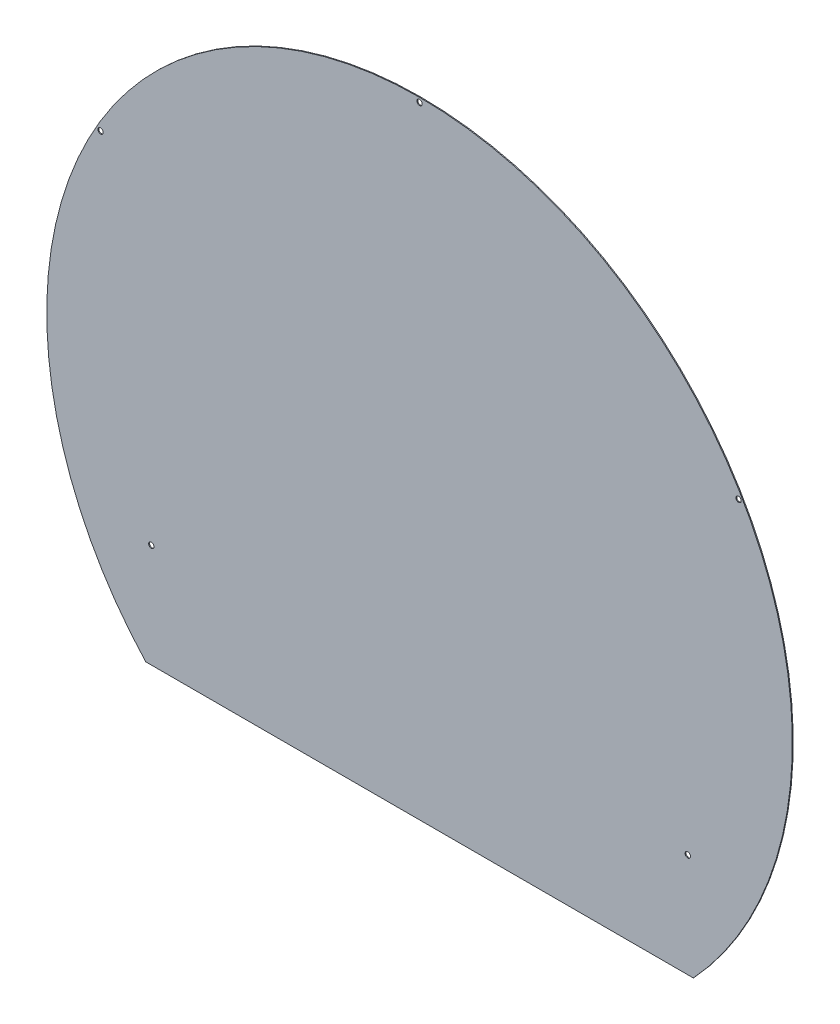
ISO-10303-21;
HEADER;
FILE_DESCRIPTION(('STEP AP214'),'2;1');
FILE_NAME('part.step','',(''),(''),'','','');
FILE_SCHEMA(('AUTOMOTIVE_DESIGN { 1 0 10303 214 1 1 1 1 }'));
ENDSEC;
DATA;
#1=APPLICATION_CONTEXT('core data for automotive mechanical design processes');
#2=APPLICATION_PROTOCOL_DEFINITION('international standard','automotive_design',2000,#1);
#3=PRODUCT_CONTEXT('',#1,'mechanical');
#4=PRODUCT('Part','Part','',(#3));
#5=PRODUCT_RELATED_PRODUCT_CATEGORY('part','',(#4));
#6=PRODUCT_DEFINITION_FORMATION('','',#4);
#7=PRODUCT_DEFINITION_CONTEXT('part definition',#1,'design');
#8=PRODUCT_DEFINITION('design','',#6,#7);
#9=PRODUCT_DEFINITION_SHAPE('','',#8);
#10=(LENGTH_UNIT() NAMED_UNIT(*) SI_UNIT(.MILLI.,.METRE.));
#11=(NAMED_UNIT(*) PLANE_ANGLE_UNIT() SI_UNIT($,.RADIAN.));
#12=(NAMED_UNIT(*) SI_UNIT($,.STERADIAN.) SOLID_ANGLE_UNIT());
#13=UNCERTAINTY_MEASURE_WITH_UNIT(LENGTH_MEASURE(1.E-05),#10,'distance_accuracy_value','');
#14=(GEOMETRIC_REPRESENTATION_CONTEXT(3) GLOBAL_UNCERTAINTY_ASSIGNED_CONTEXT((#13)) GLOBAL_UNIT_ASSIGNED_CONTEXT((#10,
#11,#12)) REPRESENTATION_CONTEXT('',''));
#15=CARTESIAN_POINT('',(0.,0.,0.));
#16=DIRECTION('',(0.,0.,1.));
#17=DIRECTION('',(1.,0.,0.));
#18=AXIS2_PLACEMENT_3D('',#15,#16,#17);
#19=CARTESIAN_POINT('',(0.,283.,-1.));
#20=DIRECTION('',(0.,0.,1.));
#21=DIRECTION('',(1.,0.,0.));
#22=AXIS2_PLACEMENT_3D('',#19,#20,#21);
#23=CYLINDRICAL_SURFACE('',#22,417.);
#24=CARTESIAN_POINT('',(0.,283.,0.));
#25=DIRECTION('',(0.,0.,1.));
#26=DIRECTION('',(-1.,0.,0.));
#27=AXIS2_PLACEMENT_3D('',#24,#25,#26);
#28=CIRCLE('',#27,417.);
#29=CARTESIAN_POINT('',(306.267856622271,0.,0.));
#30=VERTEX_POINT('',#29);
#31=CARTESIAN_POINT('',(-306.267856622271,0.,0.));
#32=VERTEX_POINT('',#31);
#33=EDGE_CURVE('E64',#30,#32,#28,.T.);
#34=ORIENTED_EDGE('',*,*,#33,.F.);
#35=DIRECTION('',(0.,0.,1.));
#36=VECTOR('',#35,1.);
#37=CARTESIAN_POINT('',(306.267856622271,0.,-1.));
#38=LINE('',#37,#36);
#39=CARTESIAN_POINT('',(306.267856622271,0.,-1.));
#40=VERTEX_POINT('',#39);
#41=EDGE_CURVE('E11',#40,#30,#38,.T.);
#42=ORIENTED_EDGE('',*,*,#41,.F.);
#43=CARTESIAN_POINT('',(0.,283.,-1.));
#44=DIRECTION('',(0.,0.,1.));
#45=DIRECTION('',(-1.,0.,0.));
#46=AXIS2_PLACEMENT_3D('',#43,#44,#45);
#47=CIRCLE('',#46,417.);
#48=CARTESIAN_POINT('',(-306.267856622271,0.,-1.));
#49=VERTEX_POINT('',#48);
#50=EDGE_CURVE('E69',#40,#49,#47,.T.);
#51=ORIENTED_EDGE('',*,*,#50,.T.);
#52=DIRECTION('',(0.,0.,1.));
#53=VECTOR('',#52,1.);
#54=CARTESIAN_POINT('',(-306.267856622271,0.,-1.));
#55=LINE('',#54,#53);
#56=EDGE_CURVE('E38',#49,#32,#55,.T.);
#57=ORIENTED_EDGE('',*,*,#56,.T.);
#58=EDGE_LOOP('',(#34,#42,#51,#57));
#59=FACE_BOUND('',#58,.T.);
#60=ADVANCED_FACE('F35',(#59),#23,.T.);
#61=CARTESIAN_POINT('',(-306.267856622271,0.,-1.));
#62=DIRECTION('',(0.,-1.,0.));
#63=DIRECTION('',(0.,0.,-1.));
#64=AXIS2_PLACEMENT_3D('',#61,#62,#63);
#65=PLANE('',#64);
#66=DIRECTION('',(1.,0.,0.));
#67=VECTOR('',#66,1.);
#68=CARTESIAN_POINT('',(-306.267856622271,0.,0.));
#69=LINE('',#68,#67);
#70=EDGE_CURVE('E61',#32,#30,#69,.T.);
#71=ORIENTED_EDGE('',*,*,#70,.F.);
#72=ORIENTED_EDGE('',*,*,#56,.F.);
#73=DIRECTION('',(1.,0.,0.));
#74=VECTOR('',#73,1.);
#75=CARTESIAN_POINT('',(-306.267856622271,0.,-1.));
#76=LINE('',#75,#74);
#77=EDGE_CURVE('E63',#49,#40,#76,.T.);
#78=ORIENTED_EDGE('',*,*,#77,.T.);
#79=ORIENTED_EDGE('',*,*,#41,.T.);
#80=EDGE_LOOP('',(#71,#72,#78,#79));
#81=FACE_BOUND('',#80,.T.);
#82=ADVANCED_FACE('F59',(#81),#65,.T.);
#83=CARTESIAN_POINT('',(0.,283.,-1.));
#84=DIRECTION('',(0.,0.,-1.));
#85=DIRECTION('',(-1.,0.,0.));
#86=AXIS2_PLACEMENT_3D('',#83,#84,#85);
#87=PLANE('',#86);
#88=CARTESIAN_POINT('',(-356.80246635919,488.999999999998,-1.));
#89=DIRECTION('',(0.,0.,1.));
#90=DIRECTION('',(1.,0.,0.));
#91=AXIS2_PLACEMENT_3D('',#88,#89,#90);
#92=CIRCLE('',#91,2.99999999999996);
#93=CARTESIAN_POINT('',(-353.80246635919,488.999999999998,-1.));
#94=VERTEX_POINT('',#93);
#95=EDGE_CURVE('E95',#94,#94,#92,.T.);
#96=ORIENTED_EDGE('',*,*,#95,.T.);
#97=EDGE_LOOP('',(#96));
#98=FACE_BOUND('',#97,.T.);
#99=CARTESIAN_POINT('',(356.802466359188,489.000000000001,-1.));
#100=DIRECTION('',(0.,0.,1.));
#101=DIRECTION('',(1.,0.,0.));
#102=AXIS2_PLACEMENT_3D('',#99,#100,#101);
#103=CIRCLE('',#102,2.99999999999999);
#104=CARTESIAN_POINT('',(359.802466359188,489.000000000001,-1.));
#105=VERTEX_POINT('',#104);
#106=EDGE_CURVE('E89',#105,#105,#103,.T.);
#107=ORIENTED_EDGE('',*,*,#106,.T.);
#108=EDGE_LOOP('',(#107));
#109=FACE_BOUND('',#108,.T.);
#110=CARTESIAN_POINT('',(0.,695.,-1.));
#111=DIRECTION('',(0.,0.,1.));
#112=DIRECTION('',(1.,0.,0.));
#113=AXIS2_PLACEMENT_3D('',#110,#111,#112);
#114=CIRCLE('',#113,3.);
#115=CARTESIAN_POINT('',(3.,695.,-1.));
#116=VERTEX_POINT('',#115);
#117=EDGE_CURVE('E83',#116,#116,#114,.T.);
#118=ORIENTED_EDGE('',*,*,#117,.T.);
#119=EDGE_LOOP('',(#118));
#120=FACE_BOUND('',#119,.T.);
#121=CARTESIAN_POINT('',(300.,116.083573561537,-1.));
#122=DIRECTION('',(0.,0.,1.));
#123=DIRECTION('',(1.,0.,0.));
#124=AXIS2_PLACEMENT_3D('',#121,#122,#123);
#125=CIRCLE('',#124,2.99999999999999);
#126=CARTESIAN_POINT('',(303.,116.083573561537,-1.));
#127=VERTEX_POINT('',#126);
#128=EDGE_CURVE('E77',#127,#127,#125,.T.);
#129=ORIENTED_EDGE('',*,*,#128,.T.);
#130=EDGE_LOOP('',(#129));
#131=FACE_BOUND('',#130,.T.);
#132=CARTESIAN_POINT('',(-300.,116.083573561537,-1.));
#133=DIRECTION('',(0.,0.,1.));
#134=DIRECTION('',(1.,0.,0.));
#135=AXIS2_PLACEMENT_3D('',#132,#133,#134);
#136=CIRCLE('',#135,2.99999999999999);
#137=CARTESIAN_POINT('',(-297.,116.083573561537,-1.));
#138=VERTEX_POINT('',#137);
#139=EDGE_CURVE('E66',#138,#138,#136,.T.);
#140=ORIENTED_EDGE('',*,*,#139,.T.);
#141=EDGE_LOOP('',(#140));
#142=FACE_BOUND('',#141,.T.);
#143=ORIENTED_EDGE('',*,*,#50,.F.);
#144=ORIENTED_EDGE('',*,*,#77,.F.);
#145=EDGE_LOOP('',(#143,#144));
#146=FACE_BOUND('',#145,.T.);
#147=ADVANCED_FACE('F104',(#98,#109,#120,#131,#142,#146),#87,.T.);
#148=CARTESIAN_POINT('',(0.,283.,0.));
#149=DIRECTION('',(0.,0.,-1.));
#150=DIRECTION('',(-1.,0.,0.));
#151=AXIS2_PLACEMENT_3D('',#148,#149,#150);
#152=PLANE('',#151);
#153=CARTESIAN_POINT('',(-356.80246635919,488.999999999998,0.));
#154=DIRECTION('',(0.,0.,1.));
#155=DIRECTION('',(1.,0.,0.));
#156=AXIS2_PLACEMENT_3D('',#153,#154,#155);
#157=CIRCLE('',#156,2.99999999999996);
#158=CARTESIAN_POINT('',(-353.80246635919,488.999999999998,0.));
#159=VERTEX_POINT('',#158);
#160=EDGE_CURVE('E98',#159,#159,#157,.T.);
#161=ORIENTED_EDGE('',*,*,#160,.F.);
#162=EDGE_LOOP('',(#161));
#163=FACE_BOUND('',#162,.T.);
#164=CARTESIAN_POINT('',(356.802466359188,489.000000000001,0.));
#165=DIRECTION('',(0.,0.,1.));
#166=DIRECTION('',(1.,0.,0.));
#167=AXIS2_PLACEMENT_3D('',#164,#165,#166);
#168=CIRCLE('',#167,2.99999999999999);
#169=CARTESIAN_POINT('',(359.802466359188,489.000000000001,0.));
#170=VERTEX_POINT('',#169);
#171=EDGE_CURVE('E92',#170,#170,#168,.T.);
#172=ORIENTED_EDGE('',*,*,#171,.F.);
#173=EDGE_LOOP('',(#172));
#174=FACE_BOUND('',#173,.T.);
#175=CARTESIAN_POINT('',(0.,695.,0.));
#176=DIRECTION('',(0.,0.,1.));
#177=DIRECTION('',(1.,0.,0.));
#178=AXIS2_PLACEMENT_3D('',#175,#176,#177);
#179=CIRCLE('',#178,3.);
#180=CARTESIAN_POINT('',(3.,695.,0.));
#181=VERTEX_POINT('',#180);
#182=EDGE_CURVE('E86',#181,#181,#179,.T.);
#183=ORIENTED_EDGE('',*,*,#182,.F.);
#184=EDGE_LOOP('',(#183));
#185=FACE_BOUND('',#184,.T.);
#186=CARTESIAN_POINT('',(300.,116.083573561537,0.));
#187=DIRECTION('',(0.,0.,1.));
#188=DIRECTION('',(1.,0.,0.));
#189=AXIS2_PLACEMENT_3D('',#186,#187,#188);
#190=CIRCLE('',#189,2.99999999999999);
#191=CARTESIAN_POINT('',(303.,116.083573561537,0.));
#192=VERTEX_POINT('',#191);
#193=EDGE_CURVE('E80',#192,#192,#190,.T.);
#194=ORIENTED_EDGE('',*,*,#193,.F.);
#195=EDGE_LOOP('',(#194));
#196=FACE_BOUND('',#195,.T.);
#197=CARTESIAN_POINT('',(-300.,116.083573561537,0.));
#198=DIRECTION('',(0.,0.,1.));
#199=DIRECTION('',(1.,0.,0.));
#200=AXIS2_PLACEMENT_3D('',#197,#198,#199);
#201=CIRCLE('',#200,2.99999999999999);
#202=CARTESIAN_POINT('',(-297.,116.083573561537,0.));
#203=VERTEX_POINT('',#202);
#204=EDGE_CURVE('E74',#203,#203,#201,.T.);
#205=ORIENTED_EDGE('',*,*,#204,.F.);
#206=EDGE_LOOP('',(#205));
#207=FACE_BOUND('',#206,.T.);
#208=ORIENTED_EDGE('',*,*,#33,.T.);
#209=ORIENTED_EDGE('',*,*,#70,.T.);
#210=EDGE_LOOP('',(#208,#209));
#211=FACE_BOUND('',#210,.T.);
#212=ADVANCED_FACE('F68',(#163,#174,#185,#196,#207,#211),#152,.F.);
#213=CARTESIAN_POINT('',(-300.,116.083573561537,-1.));
#214=DIRECTION('',(0.,0.,1.));
#215=DIRECTION('',(1.,0.,0.));
#216=AXIS2_PLACEMENT_3D('',#213,#214,#215);
#217=CYLINDRICAL_SURFACE('',#216,2.99999999999999);
#218=ORIENTED_EDGE('',*,*,#139,.F.);
#219=EDGE_LOOP('',(#218));
#220=FACE_BOUND('',#219,.T.);
#221=ORIENTED_EDGE('',*,*,#204,.T.);
#222=EDGE_LOOP('',(#221));
#223=FACE_BOUND('',#222,.T.);
#224=ADVANCED_FACE('F116',(#220,#223),#217,.F.);
#225=CARTESIAN_POINT('',(300.,116.083573561537,-1.));
#226=DIRECTION('',(0.,0.,1.));
#227=DIRECTION('',(1.,0.,0.));
#228=AXIS2_PLACEMENT_3D('',#225,#226,#227);
#229=CYLINDRICAL_SURFACE('',#228,2.99999999999999);
#230=ORIENTED_EDGE('',*,*,#128,.F.);
#231=EDGE_LOOP('',(#230));
#232=FACE_BOUND('',#231,.T.);
#233=ORIENTED_EDGE('',*,*,#193,.T.);
#234=EDGE_LOOP('',(#233));
#235=FACE_BOUND('',#234,.T.);
#236=ADVANCED_FACE('F127',(#232,#235),#229,.F.);
#237=CARTESIAN_POINT('',(0.,695.,-1.));
#238=DIRECTION('',(0.,0.,1.));
#239=DIRECTION('',(1.,0.,0.));
#240=AXIS2_PLACEMENT_3D('',#237,#238,#239);
#241=CYLINDRICAL_SURFACE('',#240,3.);
#242=ORIENTED_EDGE('',*,*,#117,.F.);
#243=EDGE_LOOP('',(#242));
#244=FACE_BOUND('',#243,.T.);
#245=ORIENTED_EDGE('',*,*,#182,.T.);
#246=EDGE_LOOP('',(#245));
#247=FACE_BOUND('',#246,.T.);
#248=ADVANCED_FACE('F133',(#244,#247),#241,.F.);
#249=CARTESIAN_POINT('',(356.802466359188,489.000000000001,-1.));
#250=DIRECTION('',(0.,0.,1.));
#251=DIRECTION('',(1.,0.,0.));
#252=AXIS2_PLACEMENT_3D('',#249,#250,#251);
#253=CYLINDRICAL_SURFACE('',#252,2.99999999999999);
#254=ORIENTED_EDGE('',*,*,#106,.F.);
#255=EDGE_LOOP('',(#254));
#256=FACE_BOUND('',#255,.T.);
#257=ORIENTED_EDGE('',*,*,#171,.T.);
#258=EDGE_LOOP('',(#257));
#259=FACE_BOUND('',#258,.T.);
#260=ADVANCED_FACE('F110',(#256,#259),#253,.F.);
#261=CARTESIAN_POINT('',(-356.80246635919,488.999999999998,-1.));
#262=DIRECTION('',(0.,0.,1.));
#263=DIRECTION('',(1.,0.,0.));
#264=AXIS2_PLACEMENT_3D('',#261,#262,#263);
#265=CYLINDRICAL_SURFACE('',#264,2.99999999999996);
#266=ORIENTED_EDGE('',*,*,#95,.F.);
#267=EDGE_LOOP('',(#266));
#268=FACE_BOUND('',#267,.T.);
#269=ORIENTED_EDGE('',*,*,#160,.T.);
#270=EDGE_LOOP('',(#269));
#271=FACE_BOUND('',#270,.T.);
#272=ADVANCED_FACE('F107',(#268,#271),#265,.F.);
#273=CLOSED_SHELL('',(#60,#82,#147,#212,#224,#236,#248,#260,#272));
#274=MANIFOLD_SOLID_BREP('B2',#273);
#275=ADVANCED_BREP_SHAPE_REPRESENTATION('',(#18,#274),#14);
#276=SHAPE_DEFINITION_REPRESENTATION(#9,#275);
ENDSEC;
END-ISO-10303-21;
